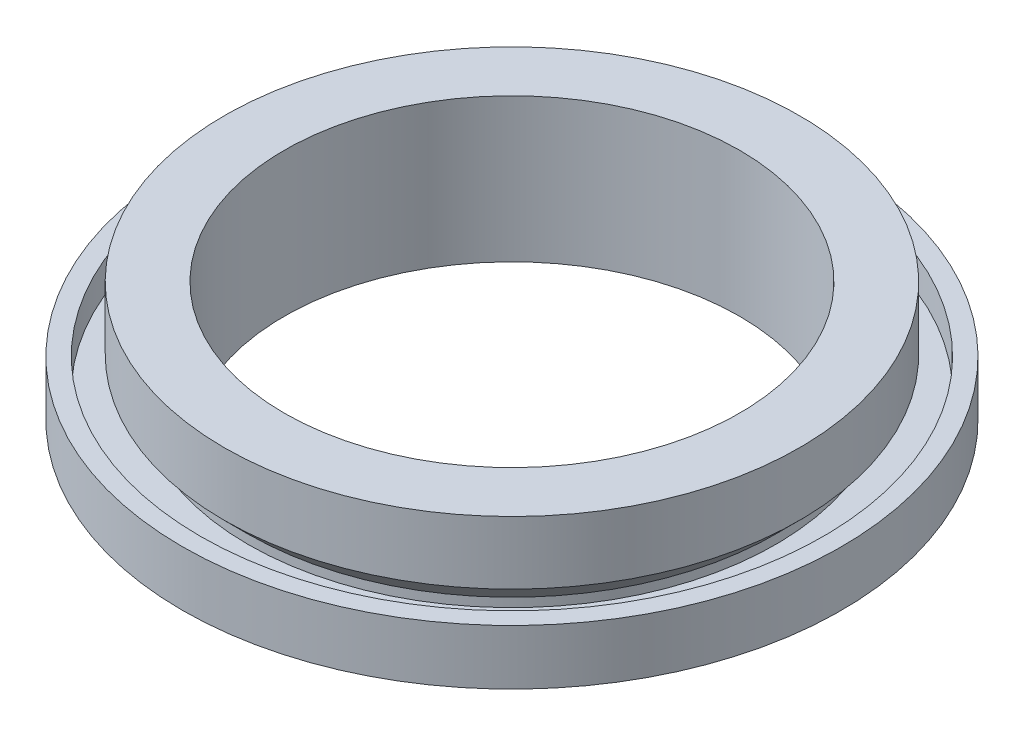
ISO-10303-21;
HEADER;
FILE_DESCRIPTION(('STEP AP214'),'2;1');
FILE_NAME('part.step','',(''),(''),'','','');
FILE_SCHEMA(('AUTOMOTIVE_DESIGN { 1 0 10303 214 1 1 1 1 }'));
ENDSEC;
DATA;
#1=APPLICATION_CONTEXT('core data for automotive mechanical design processes');
#2=APPLICATION_PROTOCOL_DEFINITION('international standard','automotive_design',2000,#1);
#3=PRODUCT_CONTEXT('',#1,'mechanical');
#4=PRODUCT('Part','Part','',(#3));
#5=PRODUCT_RELATED_PRODUCT_CATEGORY('part','',(#4));
#6=PRODUCT_DEFINITION_FORMATION('','',#4);
#7=PRODUCT_DEFINITION_CONTEXT('part definition',#1,'design');
#8=PRODUCT_DEFINITION('design','',#6,#7);
#9=PRODUCT_DEFINITION_SHAPE('','',#8);
#10=(LENGTH_UNIT() NAMED_UNIT(*) SI_UNIT(.MILLI.,.METRE.));
#11=(NAMED_UNIT(*) PLANE_ANGLE_UNIT() SI_UNIT($,.RADIAN.));
#12=(NAMED_UNIT(*) SI_UNIT($,.STERADIAN.) SOLID_ANGLE_UNIT());
#13=UNCERTAINTY_MEASURE_WITH_UNIT(LENGTH_MEASURE(1.E-05),#10,'distance_accuracy_value','');
#14=(GEOMETRIC_REPRESENTATION_CONTEXT(3) GLOBAL_UNCERTAINTY_ASSIGNED_CONTEXT((#13)) GLOBAL_UNIT_ASSIGNED_CONTEXT((#10,
#11,#12)) REPRESENTATION_CONTEXT('',''));
#15=CARTESIAN_POINT('',(0.,0.,0.));
#16=DIRECTION('',(0.,0.,1.));
#17=DIRECTION('',(1.,0.,0.));
#18=AXIS2_PLACEMENT_3D('',#15,#16,#17);
#19=CARTESIAN_POINT('',(0.,74.5728660618719,0.));
#20=DIRECTION('',(0.,1.,0.));
#21=DIRECTION('',(0.,0.,1.));
#22=AXIS2_PLACEMENT_3D('',#19,#20,#21);
#23=CYLINDRICAL_SURFACE('',#22,26.);
#24=CARTESIAN_POINT('',(0.,6.59999999999999,0.));
#25=DIRECTION('',(0.,1.,0.));
#26=DIRECTION('',(0.,0.,1.));
#27=AXIS2_PLACEMENT_3D('',#24,#25,#26);
#28=CIRCLE('',#27,26.);
#29=CARTESIAN_POINT('',(0.,6.59999999999999,26.));
#30=VERTEX_POINT('',#29);
#31=EDGE_CURVE('E42',#30,#30,#28,.T.);
#32=ORIENTED_EDGE('',*,*,#31,.T.);
#33=EDGE_LOOP('',(#32));
#34=FACE_BOUND('',#33,.T.);
#35=CARTESIAN_POINT('',(0.,3.99999999999998,0.));
#36=DIRECTION('',(0.,1.,0.));
#37=DIRECTION('',(0.,0.,1.));
#38=AXIS2_PLACEMENT_3D('',#35,#36,#37);
#39=CIRCLE('',#38,26.);
#40=CARTESIAN_POINT('',(0.,3.99999999999998,26.));
#41=VERTEX_POINT('',#40);
#42=EDGE_CURVE('E75',#41,#41,#39,.T.);
#43=ORIENTED_EDGE('',*,*,#42,.F.);
#44=EDGE_LOOP('',(#43));
#45=FACE_BOUND('',#44,.T.);
#46=ADVANCED_FACE('F31',(#34,#45),#23,.F.);
#47=CARTESIAN_POINT('',(-26.,6.6,0.));
#48=DIRECTION('',(0.,1.,0.));
#49=DIRECTION('',(0.,0.,1.));
#50=AXIS2_PLACEMENT_3D('',#47,#48,#49);
#51=PLANE('',#50);
#52=CARTESIAN_POINT('',(0.,6.59999999999999,0.));
#53=DIRECTION('',(0.,1.,0.));
#54=DIRECTION('',(0.,0.,1.));
#55=AXIS2_PLACEMENT_3D('',#52,#53,#54);
#56=CIRCLE('',#55,27.5);
#57=CARTESIAN_POINT('',(0.,6.59999999999999,27.5));
#58=VERTEX_POINT('',#57);
#59=EDGE_CURVE('E46',#58,#58,#56,.T.);
#60=ORIENTED_EDGE('',*,*,#59,.T.);
#61=EDGE_LOOP('',(#60));
#62=FACE_BOUND('',#61,.T.);
#63=ORIENTED_EDGE('',*,*,#31,.F.);
#64=EDGE_LOOP('',(#63));
#65=FACE_BOUND('',#64,.T.);
#66=ADVANCED_FACE('F83',(#62,#65),#51,.T.);
#67=CARTESIAN_POINT('',(0.,74.5728660618719,0.));
#68=DIRECTION('',(0.,1.,0.));
#69=DIRECTION('',(0.,0.,1.));
#70=AXIS2_PLACEMENT_3D('',#67,#68,#69);
#71=CYLINDRICAL_SURFACE('',#70,27.5);
#72=CARTESIAN_POINT('',(0.,2.,0.));
#73=DIRECTION('',(0.,1.,0.));
#74=DIRECTION('',(0.,0.,1.));
#75=AXIS2_PLACEMENT_3D('',#72,#73,#74);
#76=CIRCLE('',#75,27.5);
#77=CARTESIAN_POINT('',(0.,2.,27.5));
#78=VERTEX_POINT('',#77);
#79=EDGE_CURVE('E51',#78,#78,#76,.T.);
#80=ORIENTED_EDGE('',*,*,#79,.T.);
#81=EDGE_LOOP('',(#80));
#82=FACE_BOUND('',#81,.T.);
#83=ORIENTED_EDGE('',*,*,#59,.F.);
#84=EDGE_LOOP('',(#83));
#85=FACE_BOUND('',#84,.T.);
#86=ADVANCED_FACE('F88',(#82,#85),#71,.T.);
#87=CARTESIAN_POINT('',(-27.5,2.,0.));
#88=DIRECTION('',(0.,-1.,0.));
#89=DIRECTION('',(0.,0.,-1.));
#90=AXIS2_PLACEMENT_3D('',#87,#88,#89);
#91=PLANE('',#90);
#92=CARTESIAN_POINT('',(0.,2.,0.));
#93=DIRECTION('',(0.,-1.,0.));
#94=DIRECTION('',(0.,0.,-1.));
#95=AXIS2_PLACEMENT_3D('',#92,#93,#94);
#96=CIRCLE('',#95,24.75);
#97=CARTESIAN_POINT('',(0.,2.,-24.75));
#98=VERTEX_POINT('',#97);
#99=EDGE_CURVE('E38',#98,#98,#96,.F.);
#100=ORIENTED_EDGE('',*,*,#99,.T.);
#101=EDGE_LOOP('',(#100));
#102=FACE_BOUND('',#101,.T.);
#103=ORIENTED_EDGE('',*,*,#79,.F.);
#104=EDGE_LOOP('',(#103));
#105=FACE_BOUND('',#104,.T.);
#106=ADVANCED_FACE('F94',(#102,#105),#91,.T.);
#107=CARTESIAN_POINT('',(0.,74.5728660618719,0.));
#108=DIRECTION('',(0.,1.,0.));
#109=DIRECTION('',(0.,0.,1.));
#110=AXIS2_PLACEMENT_3D('',#107,#108,#109);
#111=CYLINDRICAL_SURFACE('',#110,23.75);
#112=CARTESIAN_POINT('',(0.,1.,0.));
#113=DIRECTION('',(0.,-1.,0.));
#114=DIRECTION('',(0.,0.,-1.));
#115=AXIS2_PLACEMENT_3D('',#112,#113,#114);
#116=CIRCLE('',#115,23.75);
#117=CARTESIAN_POINT('',(0.,1.,-23.75));
#118=VERTEX_POINT('',#117);
#119=EDGE_CURVE('E10',#118,#118,#116,.T.);
#120=ORIENTED_EDGE('',*,*,#119,.T.);
#121=EDGE_LOOP('',(#120));
#122=FACE_BOUND('',#121,.T.);
#123=CARTESIAN_POINT('',(0.,0.,0.));
#124=DIRECTION('',(0.,1.,0.));
#125=DIRECTION('',(0.,0.,1.));
#126=AXIS2_PLACEMENT_3D('',#123,#124,#125);
#127=CIRCLE('',#126,23.75);
#128=CARTESIAN_POINT('',(0.,0.,23.75));
#129=VERTEX_POINT('',#128);
#130=EDGE_CURVE('E54',#129,#129,#127,.T.);
#131=ORIENTED_EDGE('',*,*,#130,.T.);
#132=EDGE_LOOP('',(#131));
#133=FACE_BOUND('',#132,.T.);
#134=ADVANCED_FACE('F98',(#122,#133),#111,.T.);
#135=CARTESIAN_POINT('',(-19.,0.,0.));
#136=DIRECTION('',(0.,-1.,0.));
#137=DIRECTION('',(0.,0.,-1.));
#138=AXIS2_PLACEMENT_3D('',#135,#136,#137);
#139=PLANE('',#138);
#140=CARTESIAN_POINT('',(0.,0.,0.));
#141=DIRECTION('',(0.,1.,0.));
#142=DIRECTION('',(0.,0.,1.));
#143=AXIS2_PLACEMENT_3D('',#140,#141,#142);
#144=CIRCLE('',#143,19.);
#145=CARTESIAN_POINT('',(0.,0.,19.));
#146=VERTEX_POINT('',#145);
#147=EDGE_CURVE('E57',#146,#146,#144,.T.);
#148=ORIENTED_EDGE('',*,*,#147,.T.);
#149=EDGE_LOOP('',(#148));
#150=FACE_BOUND('',#149,.T.);
#151=ORIENTED_EDGE('',*,*,#130,.F.);
#152=EDGE_LOOP('',(#151));
#153=FACE_BOUND('',#152,.T.);
#154=ADVANCED_FACE('F101',(#150,#153),#139,.T.);
#155=CARTESIAN_POINT('',(0.,74.5728660618719,0.));
#156=DIRECTION('',(0.,1.,0.));
#157=DIRECTION('',(0.,0.,1.));
#158=AXIS2_PLACEMENT_3D('',#155,#156,#157);
#159=CYLINDRICAL_SURFACE('',#158,19.);
#160=CARTESIAN_POINT('',(0.,12.,0.));
#161=DIRECTION('',(0.,1.,0.));
#162=DIRECTION('',(0.,0.,1.));
#163=AXIS2_PLACEMENT_3D('',#160,#161,#162);
#164=CIRCLE('',#163,19.);
#165=CARTESIAN_POINT('',(0.,12.,19.));
#166=VERTEX_POINT('',#165);
#167=EDGE_CURVE('E60',#166,#166,#164,.T.);
#168=ORIENTED_EDGE('',*,*,#167,.T.);
#169=EDGE_LOOP('',(#168));
#170=FACE_BOUND('',#169,.T.);
#171=ORIENTED_EDGE('',*,*,#147,.F.);
#172=EDGE_LOOP('',(#171));
#173=FACE_BOUND('',#172,.T.);
#174=ADVANCED_FACE('F104',(#170,#173),#159,.F.);
#175=CARTESIAN_POINT('',(-24.,12.,0.));
#176=DIRECTION('',(0.,1.,0.));
#177=DIRECTION('',(0.,0.,1.));
#178=AXIS2_PLACEMENT_3D('',#175,#176,#177);
#179=PLANE('',#178);
#180=CARTESIAN_POINT('',(0.,12.,0.));
#181=DIRECTION('',(0.,1.,0.));
#182=DIRECTION('',(0.,0.,1.));
#183=AXIS2_PLACEMENT_3D('',#180,#181,#182);
#184=CIRCLE('',#183,24.);
#185=CARTESIAN_POINT('',(0.,12.,24.));
#186=VERTEX_POINT('',#185);
#187=EDGE_CURVE('E63',#186,#186,#184,.T.);
#188=ORIENTED_EDGE('',*,*,#187,.T.);
#189=EDGE_LOOP('',(#188));
#190=FACE_BOUND('',#189,.T.);
#191=ORIENTED_EDGE('',*,*,#167,.F.);
#192=EDGE_LOOP('',(#191));
#193=FACE_BOUND('',#192,.T.);
#194=ADVANCED_FACE('F108',(#190,#193),#179,.T.);
#195=CARTESIAN_POINT('',(0.,74.5728660618719,0.));
#196=DIRECTION('',(0.,1.,0.));
#197=DIRECTION('',(0.,0.,1.));
#198=AXIS2_PLACEMENT_3D('',#195,#196,#197);
#199=CYLINDRICAL_SURFACE('',#198,24.);
#200=CARTESIAN_POINT('',(0.,6.74999999999998,0.));
#201=DIRECTION('',(0.,1.,0.));
#202=DIRECTION('',(0.,0.,1.));
#203=AXIS2_PLACEMENT_3D('',#200,#201,#202);
#204=CIRCLE('',#203,24.);
#205=CARTESIAN_POINT('',(0.,6.74999999999998,24.));
#206=VERTEX_POINT('',#205);
#207=EDGE_CURVE('E66',#206,#206,#204,.T.);
#208=ORIENTED_EDGE('',*,*,#207,.T.);
#209=EDGE_LOOP('',(#208));
#210=FACE_BOUND('',#209,.T.);
#211=ORIENTED_EDGE('',*,*,#187,.F.);
#212=EDGE_LOOP('',(#211));
#213=FACE_BOUND('',#212,.T.);
#214=ADVANCED_FACE('F112',(#210,#213),#199,.T.);
#215=CARTESIAN_POINT('',(0.,6.74999999999998,0.));
#216=DIRECTION('',(0.,1.,0.));
#217=DIRECTION('',(0.,0.,1.));
#218=AXIS2_PLACEMENT_3D('',#215,#216,#217);
#219=CONICAL_SURFACE('',#218,24.,0.785398163397451);
#220=CARTESIAN_POINT('',(0.,4.74999999999999,0.));
#221=DIRECTION('',(0.,1.,0.));
#222=DIRECTION('',(0.,0.,1.));
#223=AXIS2_PLACEMENT_3D('',#220,#221,#222);
#224=CIRCLE('',#223,22.);
#225=CARTESIAN_POINT('',(0.,4.74999999999999,22.));
#226=VERTEX_POINT('',#225);
#227=EDGE_CURVE('E69',#226,#226,#224,.T.);
#228=ORIENTED_EDGE('',*,*,#227,.T.);
#229=EDGE_LOOP('',(#228));
#230=FACE_BOUND('',#229,.T.);
#231=ORIENTED_EDGE('',*,*,#207,.F.);
#232=EDGE_LOOP('',(#231));
#233=FACE_BOUND('',#232,.T.);
#234=ADVANCED_FACE('F116',(#230,#233),#219,.T.);
#235=CARTESIAN_POINT('',(0.,74.5728660618719,0.));
#236=DIRECTION('',(0.,1.,0.));
#237=DIRECTION('',(0.,0.,1.));
#238=AXIS2_PLACEMENT_3D('',#235,#236,#237);
#239=CYLINDRICAL_SURFACE('',#238,22.);
#240=CARTESIAN_POINT('',(0.,3.99999999999999,0.));
#241=DIRECTION('',(0.,1.,0.));
#242=DIRECTION('',(0.,0.,1.));
#243=AXIS2_PLACEMENT_3D('',#240,#241,#242);
#244=CIRCLE('',#243,22.);
#245=CARTESIAN_POINT('',(0.,3.99999999999999,22.));
#246=VERTEX_POINT('',#245);
#247=EDGE_CURVE('E72',#246,#246,#244,.T.);
#248=ORIENTED_EDGE('',*,*,#247,.T.);
#249=EDGE_LOOP('',(#248));
#250=FACE_BOUND('',#249,.T.);
#251=ORIENTED_EDGE('',*,*,#227,.F.);
#252=EDGE_LOOP('',(#251));
#253=FACE_BOUND('',#252,.T.);
#254=ADVANCED_FACE('F120',(#250,#253),#239,.T.);
#255=CARTESIAN_POINT('',(-26.,3.99999999999998,0.));
#256=DIRECTION('',(0.,1.,0.));
#257=DIRECTION('',(0.,0.,1.));
#258=AXIS2_PLACEMENT_3D('',#255,#256,#257);
#259=PLANE('',#258);
#260=ORIENTED_EDGE('',*,*,#42,.T.);
#261=EDGE_LOOP('',(#260));
#262=FACE_BOUND('',#261,.T.);
#263=ORIENTED_EDGE('',*,*,#247,.F.);
#264=EDGE_LOOP('',(#263));
#265=FACE_BOUND('',#264,.T.);
#266=ADVANCED_FACE('F79',(#262,#265),#259,.T.);
#267=CARTESIAN_POINT('',(0.,1.,0.));
#268=DIRECTION('',(0.,-1.,0.));
#269=DIRECTION('',(0.,0.,-1.));
#270=AXIS2_PLACEMENT_3D('',#267,#268,#269);
#271=TOROIDAL_SURFACE('',#270,24.75,1.);
#272=ORIENTED_EDGE('',*,*,#119,.F.);
#273=EDGE_LOOP('',(#272));
#274=FACE_BOUND('',#273,.T.);
#275=ORIENTED_EDGE('',*,*,#99,.F.);
#276=EDGE_LOOP('',(#275));
#277=FACE_BOUND('',#276,.T.);
#278=ADVANCED_FACE('F33',(#274,#277),#271,.F.);
#279=CLOSED_SHELL('',(#46,#66,#86,#106,#134,#154,#174,#194,#214,#234,#254,#266,#278));
#280=MANIFOLD_SOLID_BREP('B2',#279);
#281=ADVANCED_BREP_SHAPE_REPRESENTATION('',(#18,#280),#14);
#282=SHAPE_DEFINITION_REPRESENTATION(#9,#281);
ENDSEC;
END-ISO-10303-21;
